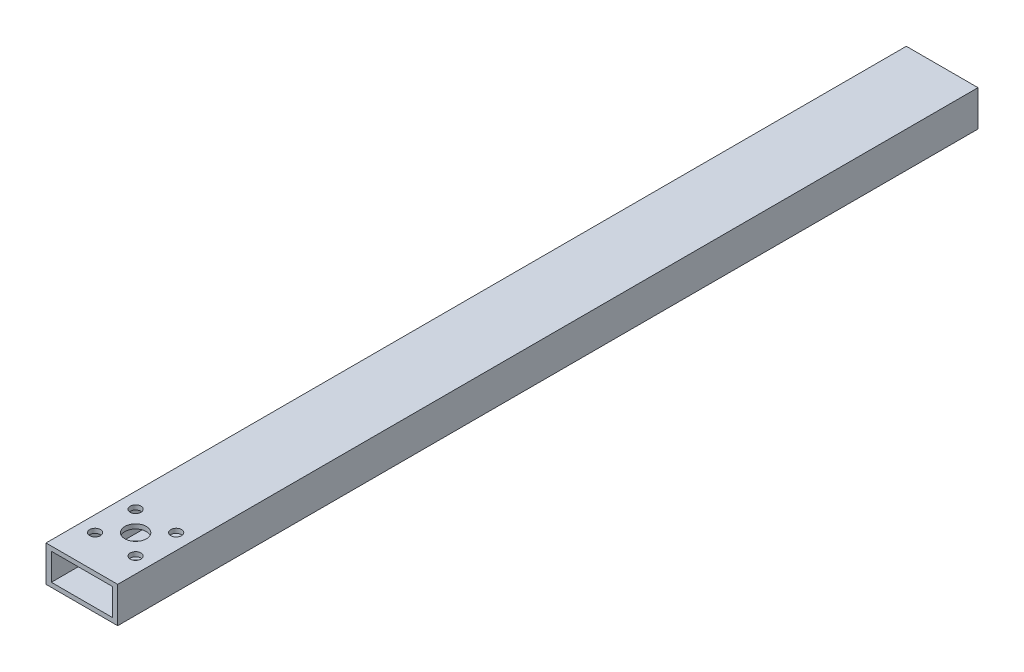
ISO-10303-21;
HEADER;
FILE_DESCRIPTION(('STEP AP214'),'2;1');
FILE_NAME('part.step','',(''),(''),'','','');
FILE_SCHEMA(('AUTOMOTIVE_DESIGN { 1 0 10303 214 1 1 1 1 }'));
ENDSEC;
DATA;
#1=APPLICATION_CONTEXT('core data for automotive mechanical design processes');
#2=APPLICATION_PROTOCOL_DEFINITION('international standard','automotive_design',2000,#1);
#3=PRODUCT_CONTEXT('',#1,'mechanical');
#4=PRODUCT('Part','Part','',(#3));
#5=PRODUCT_RELATED_PRODUCT_CATEGORY('part','',(#4));
#6=PRODUCT_DEFINITION_FORMATION('','',#4);
#7=PRODUCT_DEFINITION_CONTEXT('part definition',#1,'design');
#8=PRODUCT_DEFINITION('design','',#6,#7);
#9=PRODUCT_DEFINITION_SHAPE('','',#8);
#10=(LENGTH_UNIT() NAMED_UNIT(*) SI_UNIT(.MILLI.,.METRE.));
#11=(NAMED_UNIT(*) PLANE_ANGLE_UNIT() SI_UNIT($,.RADIAN.));
#12=(NAMED_UNIT(*) SI_UNIT($,.STERADIAN.) SOLID_ANGLE_UNIT());
#13=UNCERTAINTY_MEASURE_WITH_UNIT(LENGTH_MEASURE(1.E-05),#10,'distance_accuracy_value','');
#14=(GEOMETRIC_REPRESENTATION_CONTEXT(3) GLOBAL_UNCERTAINTY_ASSIGNED_CONTEXT((#13)) GLOBAL_UNIT_ASSIGNED_CONTEXT((#10,
#11,#12)) REPRESENTATION_CONTEXT('',''));
#15=CARTESIAN_POINT('',(0.,0.,0.));
#16=DIRECTION('',(0.,0.,1.));
#17=DIRECTION('',(1.,0.,0.));
#18=AXIS2_PLACEMENT_3D('',#15,#16,#17);
#19=CARTESIAN_POINT('',(0.,0.,200.));
#20=DIRECTION('',(0.,0.,1.));
#21=DIRECTION('',(1.,0.,0.));
#22=AXIS2_PLACEMENT_3D('',#19,#20,#21);
#23=PLANE('',#22);
#24=DIRECTION('',(0.,1.,0.));
#25=VECTOR('',#24,1.);
#26=CARTESIAN_POINT('',(10.,5.,200.));
#27=LINE('',#26,#25);
#28=CARTESIAN_POINT('',(10.,-5.,200.));
#29=VERTEX_POINT('',#28);
#30=CARTESIAN_POINT('',(10.,5.,200.));
#31=VERTEX_POINT('',#30);
#32=EDGE_CURVE('E237',#29,#31,#27,.T.);
#33=ORIENTED_EDGE('',*,*,#32,.T.);
#34=DIRECTION('',(-1.,0.,0.));
#35=VECTOR('',#34,1.);
#36=CARTESIAN_POINT('',(-10.,5.,200.));
#37=LINE('',#36,#35);
#38=CARTESIAN_POINT('',(-10.,5.,200.));
#39=VERTEX_POINT('',#38);
#40=EDGE_CURVE('E240',#31,#39,#37,.T.);
#41=ORIENTED_EDGE('',*,*,#40,.T.);
#42=DIRECTION('',(0.,-1.,0.));
#43=VECTOR('',#42,1.);
#44=CARTESIAN_POINT('',(-10.,5.,200.));
#45=LINE('',#44,#43);
#46=CARTESIAN_POINT('',(-10.,-5.,200.));
#47=VERTEX_POINT('',#46);
#48=EDGE_CURVE('E243',#39,#47,#45,.T.);
#49=ORIENTED_EDGE('',*,*,#48,.T.);
#50=DIRECTION('',(1.,0.,0.));
#51=VECTOR('',#50,1.);
#52=CARTESIAN_POINT('',(-10.,-5.,200.));
#53=LINE('',#52,#51);
#54=EDGE_CURVE('E65',#47,#29,#53,.T.);
#55=ORIENTED_EDGE('',*,*,#54,.T.);
#56=EDGE_LOOP('',(#33,#41,#49,#55));
#57=FACE_BOUND('',#56,.T.);
#58=DIRECTION('',(-1.,0.,0.));
#59=VECTOR('',#58,1.);
#60=CARTESIAN_POINT('',(-8.5,3.75,200.));
#61=LINE('',#60,#59);
#62=CARTESIAN_POINT('',(8.5,3.75,200.));
#63=VERTEX_POINT('',#62);
#64=CARTESIAN_POINT('',(-8.5,3.75,200.));
#65=VERTEX_POINT('',#64);
#66=EDGE_CURVE('E115',#63,#65,#61,.T.);
#67=ORIENTED_EDGE('',*,*,#66,.F.);
#68=DIRECTION('',(0.,1.,0.));
#69=VECTOR('',#68,1.);
#70=CARTESIAN_POINT('',(8.5,3.75,200.));
#71=LINE('',#70,#69);
#72=CARTESIAN_POINT('',(8.5,-3.75,200.));
#73=VERTEX_POINT('',#72);
#74=EDGE_CURVE('E219',#73,#63,#71,.T.);
#75=ORIENTED_EDGE('',*,*,#74,.F.);
#76=DIRECTION('',(1.,0.,0.));
#77=VECTOR('',#76,1.);
#78=CARTESIAN_POINT('',(-8.5,-3.75,200.));
#79=LINE('',#78,#77);
#80=CARTESIAN_POINT('',(-8.5,-3.75,200.));
#81=VERTEX_POINT('',#80);
#82=EDGE_CURVE('E227',#81,#73,#79,.T.);
#83=ORIENTED_EDGE('',*,*,#82,.F.);
#84=DIRECTION('',(0.,-1.,0.));
#85=VECTOR('',#84,1.);
#86=CARTESIAN_POINT('',(-8.5,3.75,200.));
#87=LINE('',#86,#85);
#88=EDGE_CURVE('E224',#65,#81,#87,.T.);
#89=ORIENTED_EDGE('',*,*,#88,.F.);
#90=EDGE_LOOP('',(#67,#75,#83,#89));
#91=FACE_BOUND('',#90,.T.);
#92=ADVANCED_FACE('F39',(#57,#91),#23,.T.);
#93=CARTESIAN_POINT('',(10.,5.,200.));
#94=DIRECTION('',(-1.,0.,0.));
#95=DIRECTION('',(0.,-1.,0.));
#96=AXIS2_PLACEMENT_3D('',#93,#94,#95);
#97=PLANE('',#96);
#98=DIRECTION('',(0.,0.,-1.));
#99=VECTOR('',#98,1.);
#100=CARTESIAN_POINT('',(10.,-5.,200.));
#101=LINE('',#100,#99);
#102=CARTESIAN_POINT('',(10.,-5.,-40.));
#103=VERTEX_POINT('',#102);
#104=EDGE_CURVE('E248',#29,#103,#101,.T.);
#105=ORIENTED_EDGE('',*,*,#104,.T.);
#106=DIRECTION('',(0.,-1.,0.));
#107=VECTOR('',#106,1.);
#108=CARTESIAN_POINT('',(10.,-5.,-40.));
#109=LINE('',#108,#107);
#110=CARTESIAN_POINT('',(10.,5.,-40.));
#111=VERTEX_POINT('',#110);
#112=EDGE_CURVE('E147',#111,#103,#109,.T.);
#113=ORIENTED_EDGE('',*,*,#112,.F.);
#114=DIRECTION('',(0.,0.,-1.));
#115=VECTOR('',#114,1.);
#116=CARTESIAN_POINT('',(10.,5.,200.));
#117=LINE('',#116,#115);
#118=EDGE_CURVE('E11',#31,#111,#117,.T.);
#119=ORIENTED_EDGE('',*,*,#118,.F.);
#120=ORIENTED_EDGE('',*,*,#32,.F.);
#121=EDGE_LOOP('',(#105,#113,#119,#120));
#122=FACE_BOUND('',#121,.T.);
#123=ADVANCED_FACE('F41',(#122),#97,.F.);
#124=CARTESIAN_POINT('',(-10.,5.,200.));
#125=DIRECTION('',(0.,-1.,0.));
#126=DIRECTION('',(0.,0.,-1.));
#127=AXIS2_PLACEMENT_3D('',#124,#125,#126);
#128=PLANE('',#127);
#129=CARTESIAN_POINT('',(-5.65685424949244,5.,190.656854249493));
#130=DIRECTION('',(0.,-1.,0.));
#131=DIRECTION('',(0.,0.,-1.));
#132=AXIS2_PLACEMENT_3D('',#129,#130,#131);
#133=CIRCLE('',#132,1.50000000000002);
#134=CARTESIAN_POINT('',(-5.65685424949244,5.,189.156854249493));
#135=VERTEX_POINT('',#134);
#136=EDGE_CURVE('E173',#135,#135,#133,.T.);
#137=ORIENTED_EDGE('',*,*,#136,.T.);
#138=EDGE_LOOP('',(#137));
#139=FACE_BOUND('',#138,.T.);
#140=CARTESIAN_POINT('',(-5.65685424949251,5.,179.343145750508));
#141=DIRECTION('',(0.,-1.,0.));
#142=DIRECTION('',(0.,0.,-1.));
#143=AXIS2_PLACEMENT_3D('',#140,#141,#142);
#144=CIRCLE('',#143,1.5);
#145=CARTESIAN_POINT('',(-5.65685424949251,5.,177.843145750508));
#146=VERTEX_POINT('',#145);
#147=EDGE_CURVE('E165',#146,#146,#144,.T.);
#148=ORIENTED_EDGE('',*,*,#147,.T.);
#149=EDGE_LOOP('',(#148));
#150=FACE_BOUND('',#149,.T.);
#151=CARTESIAN_POINT('',(5.65685424949253,5.,179.343145750508));
#152=DIRECTION('',(0.,-1.,0.));
#153=DIRECTION('',(0.,0.,-1.));
#154=AXIS2_PLACEMENT_3D('',#151,#152,#153);
#155=CIRCLE('',#154,1.50000000000002);
#156=CARTESIAN_POINT('',(5.65685424949253,5.,177.843145750508));
#157=VERTEX_POINT('',#156);
#158=EDGE_CURVE('E156',#157,#157,#155,.T.);
#159=ORIENTED_EDGE('',*,*,#158,.T.);
#160=EDGE_LOOP('',(#159));
#161=FACE_BOUND('',#160,.T.);
#162=CARTESIAN_POINT('',(5.65685424949259,5.,190.656854249493));
#163=DIRECTION('',(0.,-1.,0.));
#164=DIRECTION('',(0.,0.,-1.));
#165=AXIS2_PLACEMENT_3D('',#162,#163,#164);
#166=CIRCLE('',#165,1.49999999999994);
#167=CARTESIAN_POINT('',(5.65685424949259,5.,189.156854249493));
#168=VERTEX_POINT('',#167);
#169=EDGE_CURVE('E180',#168,#168,#166,.T.);
#170=ORIENTED_EDGE('',*,*,#169,.T.);
#171=EDGE_LOOP('',(#170));
#172=FACE_BOUND('',#171,.T.);
#173=CARTESIAN_POINT('',(0.,5.,185.));
#174=DIRECTION('',(0.,-1.,0.));
#175=DIRECTION('',(0.,0.,-1.));
#176=AXIS2_PLACEMENT_3D('',#173,#174,#175);
#177=CIRCLE('',#176,3.);
#178=CARTESIAN_POINT('',(0.,5.,182.));
#179=VERTEX_POINT('',#178);
#180=EDGE_CURVE('E207',#179,#179,#177,.T.);
#181=ORIENTED_EDGE('',*,*,#180,.T.);
#182=EDGE_LOOP('',(#181));
#183=FACE_BOUND('',#182,.T.);
#184=ORIENTED_EDGE('',*,*,#118,.T.);
#185=DIRECTION('',(1.,0.,0.));
#186=VECTOR('',#185,1.);
#187=CARTESIAN_POINT('',(10.,5.,-40.));
#188=LINE('',#187,#186);
#189=CARTESIAN_POINT('',(-10.,5.,-40.));
#190=VERTEX_POINT('',#189);
#191=EDGE_CURVE('E143',#190,#111,#188,.T.);
#192=ORIENTED_EDGE('',*,*,#191,.F.);
#193=DIRECTION('',(0.,0.,-1.));
#194=VECTOR('',#193,1.);
#195=CARTESIAN_POINT('',(-10.,5.,200.));
#196=LINE('',#195,#194);
#197=EDGE_CURVE('E49',#39,#190,#196,.T.);
#198=ORIENTED_EDGE('',*,*,#197,.F.);
#199=ORIENTED_EDGE('',*,*,#40,.F.);
#200=EDGE_LOOP('',(#184,#192,#198,#199));
#201=FACE_BOUND('',#200,.T.);
#202=ADVANCED_FACE('F293',(#139,#150,#161,#172,#183,#201),#128,.F.);
#203=CARTESIAN_POINT('',(-10.,5.,200.));
#204=DIRECTION('',(1.,0.,0.));
#205=DIRECTION('',(0.,1.,0.));
#206=AXIS2_PLACEMENT_3D('',#203,#204,#205);
#207=PLANE('',#206);
#208=ORIENTED_EDGE('',*,*,#197,.T.);
#209=DIRECTION('',(0.,1.,0.));
#210=VECTOR('',#209,1.);
#211=CARTESIAN_POINT('',(-10.,-5.,-40.));
#212=LINE('',#211,#210);
#213=CARTESIAN_POINT('',(-10.,-5.,-40.));
#214=VERTEX_POINT('',#213);
#215=EDGE_CURVE('E139',#214,#190,#212,.T.);
#216=ORIENTED_EDGE('',*,*,#215,.F.);
#217=DIRECTION('',(0.,0.,-1.));
#218=VECTOR('',#217,1.);
#219=CARTESIAN_POINT('',(-10.,-5.,200.));
#220=LINE('',#219,#218);
#221=EDGE_CURVE('E251',#47,#214,#220,.T.);
#222=ORIENTED_EDGE('',*,*,#221,.F.);
#223=ORIENTED_EDGE('',*,*,#48,.F.);
#224=EDGE_LOOP('',(#208,#216,#222,#223));
#225=FACE_BOUND('',#224,.T.);
#226=ADVANCED_FACE('F301',(#225),#207,.F.);
#227=CARTESIAN_POINT('',(-10.,-5.,200.));
#228=DIRECTION('',(0.,1.,0.));
#229=DIRECTION('',(0.,0.,1.));
#230=AXIS2_PLACEMENT_3D('',#227,#228,#229);
#231=PLANE('',#230);
#232=CARTESIAN_POINT('',(-5.65685424949244,-5.,190.656854249493));
#233=DIRECTION('',(0.,-1.,0.));
#234=DIRECTION('',(0.,0.,-1.));
#235=AXIS2_PLACEMENT_3D('',#232,#233,#234);
#236=CIRCLE('',#235,1.50000000000002);
#237=CARTESIAN_POINT('',(-5.65685424949244,-5.,189.156854249493));
#238=VERTEX_POINT('',#237);
#239=EDGE_CURVE('E155',#238,#238,#236,.T.);
#240=ORIENTED_EDGE('',*,*,#239,.F.);
#241=EDGE_LOOP('',(#240));
#242=FACE_BOUND('',#241,.T.);
#243=CARTESIAN_POINT('',(-5.65685424949251,-5.,179.343145750508));
#244=DIRECTION('',(0.,-1.,0.));
#245=DIRECTION('',(0.,0.,-1.));
#246=AXIS2_PLACEMENT_3D('',#243,#244,#245);
#247=CIRCLE('',#246,1.5);
#248=CARTESIAN_POINT('',(-5.65685424949251,-5.,177.843145750508));
#249=VERTEX_POINT('',#248);
#250=EDGE_CURVE('E169',#249,#249,#247,.T.);
#251=ORIENTED_EDGE('',*,*,#250,.F.);
#252=EDGE_LOOP('',(#251));
#253=FACE_BOUND('',#252,.T.);
#254=CARTESIAN_POINT('',(5.65685424949253,-5.,179.343145750508));
#255=DIRECTION('',(0.,-1.,0.));
#256=DIRECTION('',(0.,0.,-1.));
#257=AXIS2_PLACEMENT_3D('',#254,#255,#256);
#258=CIRCLE('',#257,1.50000000000002);
#259=CARTESIAN_POINT('',(5.65685424949253,-5.,177.843145750508));
#260=VERTEX_POINT('',#259);
#261=EDGE_CURVE('E161',#260,#260,#258,.T.);
#262=ORIENTED_EDGE('',*,*,#261,.F.);
#263=EDGE_LOOP('',(#262));
#264=FACE_BOUND('',#263,.T.);
#265=CARTESIAN_POINT('',(5.65685424949259,-5.,190.656854249493));
#266=DIRECTION('',(0.,-1.,0.));
#267=DIRECTION('',(0.,0.,-1.));
#268=AXIS2_PLACEMENT_3D('',#265,#266,#267);
#269=CIRCLE('',#268,1.49999999999994);
#270=CARTESIAN_POINT('',(5.65685424949259,-5.,189.156854249493));
#271=VERTEX_POINT('',#270);
#272=EDGE_CURVE('E160',#271,#271,#269,.T.);
#273=ORIENTED_EDGE('',*,*,#272,.F.);
#274=EDGE_LOOP('',(#273));
#275=FACE_BOUND('',#274,.T.);
#276=CARTESIAN_POINT('',(0.,-5.,185.));
#277=DIRECTION('',(0.,-1.,0.));
#278=DIRECTION('',(0.,0.,-1.));
#279=AXIS2_PLACEMENT_3D('',#276,#277,#278);
#280=CIRCLE('',#279,3.);
#281=CARTESIAN_POINT('',(0.,-5.,182.));
#282=VERTEX_POINT('',#281);
#283=EDGE_CURVE('E206',#282,#282,#280,.T.);
#284=ORIENTED_EDGE('',*,*,#283,.F.);
#285=EDGE_LOOP('',(#284));
#286=FACE_BOUND('',#285,.T.);
#287=ORIENTED_EDGE('',*,*,#221,.T.);
#288=DIRECTION('',(-1.,0.,0.));
#289=VECTOR('',#288,1.);
#290=CARTESIAN_POINT('',(10.,-5.,-40.));
#291=LINE('',#290,#289);
#292=EDGE_CURVE('E151',#103,#214,#291,.T.);
#293=ORIENTED_EDGE('',*,*,#292,.F.);
#294=ORIENTED_EDGE('',*,*,#104,.F.);
#295=ORIENTED_EDGE('',*,*,#54,.F.);
#296=EDGE_LOOP('',(#287,#293,#294,#295));
#297=FACE_BOUND('',#296,.T.);
#298=ADVANCED_FACE('F298',(#242,#253,#264,#275,#286,#297),#231,.F.);
#299=CARTESIAN_POINT('',(8.5,3.75,200.));
#300=DIRECTION('',(-1.,0.,0.));
#301=DIRECTION('',(0.,-1.,0.));
#302=AXIS2_PLACEMENT_3D('',#299,#300,#301);
#303=PLANE('',#302);
#304=DIRECTION('',(0.,0.,-1.));
#305=VECTOR('',#304,1.);
#306=CARTESIAN_POINT('',(8.5,3.75,200.));
#307=LINE('',#306,#305);
#308=CARTESIAN_POINT('',(8.5,3.75,-40.));
#309=VERTEX_POINT('',#308);
#310=EDGE_CURVE('E119',#63,#309,#307,.T.);
#311=ORIENTED_EDGE('',*,*,#310,.T.);
#312=DIRECTION('',(0.,-1.,0.));
#313=VECTOR('',#312,1.);
#314=CARTESIAN_POINT('',(8.5,-3.75,-40.));
#315=LINE('',#314,#313);
#316=CARTESIAN_POINT('',(8.5,-3.75,-40.));
#317=VERTEX_POINT('',#316);
#318=EDGE_CURVE('E130',#309,#317,#315,.T.);
#319=ORIENTED_EDGE('',*,*,#318,.T.);
#320=DIRECTION('',(0.,0.,-1.));
#321=VECTOR('',#320,1.);
#322=CARTESIAN_POINT('',(8.5,-3.75,200.));
#323=LINE('',#322,#321);
#324=EDGE_CURVE('E230',#73,#317,#323,.T.);
#325=ORIENTED_EDGE('',*,*,#324,.F.);
#326=ORIENTED_EDGE('',*,*,#74,.T.);
#327=EDGE_LOOP('',(#311,#319,#325,#326));
#328=FACE_BOUND('',#327,.T.);
#329=ADVANCED_FACE('F286',(#328),#303,.T.);
#330=CARTESIAN_POINT('',(-8.5,3.75,200.));
#331=DIRECTION('',(0.,-1.,0.));
#332=DIRECTION('',(0.,0.,-1.));
#333=AXIS2_PLACEMENT_3D('',#330,#331,#332);
#334=PLANE('',#333);
#335=CARTESIAN_POINT('',(-5.65685424949244,3.75,190.656854249493));
#336=DIRECTION('',(0.,-1.,0.));
#337=DIRECTION('',(0.,0.,-1.));
#338=AXIS2_PLACEMENT_3D('',#335,#336,#337);
#339=CIRCLE('',#338,1.50000000000002);
#340=CARTESIAN_POINT('',(-5.65685424949244,3.75,189.156854249493));
#341=VERTEX_POINT('',#340);
#342=EDGE_CURVE('E202',#341,#341,#339,.T.);
#343=ORIENTED_EDGE('',*,*,#342,.F.);
#344=EDGE_LOOP('',(#343));
#345=FACE_BOUND('',#344,.T.);
#346=CARTESIAN_POINT('',(-5.65685424949251,3.75,179.343145750508));
#347=DIRECTION('',(0.,-1.,0.));
#348=DIRECTION('',(0.,0.,-1.));
#349=AXIS2_PLACEMENT_3D('',#346,#347,#348);
#350=CIRCLE('',#349,1.5);
#351=CARTESIAN_POINT('',(-5.65685424949251,3.75,177.843145750508));
#352=VERTEX_POINT('',#351);
#353=EDGE_CURVE('E198',#352,#352,#350,.T.);
#354=ORIENTED_EDGE('',*,*,#353,.F.);
#355=EDGE_LOOP('',(#354));
#356=FACE_BOUND('',#355,.T.);
#357=CARTESIAN_POINT('',(5.65685424949253,3.75,179.343145750508));
#358=DIRECTION('',(0.,-1.,0.));
#359=DIRECTION('',(0.,0.,-1.));
#360=AXIS2_PLACEMENT_3D('',#357,#358,#359);
#361=CIRCLE('',#360,1.50000000000002);
#362=CARTESIAN_POINT('',(5.65685424949253,3.75,177.843145750508));
#363=VERTEX_POINT('',#362);
#364=EDGE_CURVE('E193',#363,#363,#361,.T.);
#365=ORIENTED_EDGE('',*,*,#364,.F.);
#366=EDGE_LOOP('',(#365));
#367=FACE_BOUND('',#366,.T.);
#368=CARTESIAN_POINT('',(5.65685424949259,3.75,190.656854249493));
#369=DIRECTION('',(0.,-1.,0.));
#370=DIRECTION('',(0.,0.,-1.));
#371=AXIS2_PLACEMENT_3D('',#368,#369,#370);
#372=CIRCLE('',#371,1.49999999999994);
#373=CARTESIAN_POINT('',(5.65685424949259,3.75,189.156854249493));
#374=VERTEX_POINT('',#373);
#375=EDGE_CURVE('E188',#374,#374,#372,.T.);
#376=ORIENTED_EDGE('',*,*,#375,.F.);
#377=EDGE_LOOP('',(#376));
#378=FACE_BOUND('',#377,.T.);
#379=CARTESIAN_POINT('',(0.,3.75,185.));
#380=DIRECTION('',(0.,-1.,0.));
#381=DIRECTION('',(0.,0.,-1.));
#382=AXIS2_PLACEMENT_3D('',#379,#380,#381);
#383=CIRCLE('',#382,3.);
#384=CARTESIAN_POINT('',(0.,3.75,182.));
#385=VERTEX_POINT('',#384);
#386=EDGE_CURVE('E215',#385,#385,#383,.T.);
#387=ORIENTED_EDGE('',*,*,#386,.F.);
#388=EDGE_LOOP('',(#387));
#389=FACE_BOUND('',#388,.T.);
#390=DIRECTION('',(0.,0.,-1.));
#391=VECTOR('',#390,1.);
#392=CARTESIAN_POINT('',(-8.5,3.75,200.));
#393=LINE('',#392,#391);
#394=CARTESIAN_POINT('',(-8.5,3.75,-40.));
#395=VERTEX_POINT('',#394);
#396=EDGE_CURVE('E107',#65,#395,#393,.T.);
#397=ORIENTED_EDGE('',*,*,#396,.T.);
#398=DIRECTION('',(1.,0.,0.));
#399=VECTOR('',#398,1.);
#400=CARTESIAN_POINT('',(8.5,3.75,-40.));
#401=LINE('',#400,#399);
#402=EDGE_CURVE('E112',#395,#309,#401,.T.);
#403=ORIENTED_EDGE('',*,*,#402,.T.);
#404=ORIENTED_EDGE('',*,*,#310,.F.);
#405=ORIENTED_EDGE('',*,*,#66,.T.);
#406=EDGE_LOOP('',(#397,#403,#404,#405));
#407=FACE_BOUND('',#406,.T.);
#408=ADVANCED_FACE('F109',(#345,#356,#367,#378,#389,#407),#334,.T.);
#409=CARTESIAN_POINT('',(-8.5,3.75,200.));
#410=DIRECTION('',(1.,0.,0.));
#411=DIRECTION('',(0.,1.,0.));
#412=AXIS2_PLACEMENT_3D('',#409,#410,#411);
#413=PLANE('',#412);
#414=DIRECTION('',(0.,0.,-1.));
#415=VECTOR('',#414,1.);
#416=CARTESIAN_POINT('',(-8.5,-3.75,200.));
#417=LINE('',#416,#415);
#418=CARTESIAN_POINT('',(-8.5,-3.75,-40.));
#419=VERTEX_POINT('',#418);
#420=EDGE_CURVE('E57',#81,#419,#417,.T.);
#421=ORIENTED_EDGE('',*,*,#420,.T.);
#422=DIRECTION('',(0.,1.,0.));
#423=VECTOR('',#422,1.);
#424=CARTESIAN_POINT('',(-8.5,-3.75,-40.));
#425=LINE('',#424,#423);
#426=EDGE_CURVE('E122',#419,#395,#425,.T.);
#427=ORIENTED_EDGE('',*,*,#426,.T.);
#428=ORIENTED_EDGE('',*,*,#396,.F.);
#429=ORIENTED_EDGE('',*,*,#88,.T.);
#430=EDGE_LOOP('',(#421,#427,#428,#429));
#431=FACE_BOUND('',#430,.T.);
#432=ADVANCED_FACE('F123',(#431),#413,.T.);
#433=CARTESIAN_POINT('',(-8.5,-3.75,200.));
#434=DIRECTION('',(0.,1.,0.));
#435=DIRECTION('',(0.,0.,1.));
#436=AXIS2_PLACEMENT_3D('',#433,#434,#435);
#437=PLANE('',#436);
#438=CARTESIAN_POINT('',(-5.65685424949244,-3.75,190.656854249493));
#439=DIRECTION('',(0.,1.,0.));
#440=DIRECTION('',(0.,0.,1.));
#441=AXIS2_PLACEMENT_3D('',#438,#439,#440);
#442=CIRCLE('',#441,1.50000000000002);
#443=CARTESIAN_POINT('',(-5.65685424949244,-3.75,192.156854249493));
#444=VERTEX_POINT('',#443);
#445=EDGE_CURVE('E43',#444,#444,#442,.T.);
#446=ORIENTED_EDGE('',*,*,#445,.F.);
#447=EDGE_LOOP('',(#446));
#448=FACE_BOUND('',#447,.T.);
#449=CARTESIAN_POINT('',(-5.65685424949251,-3.75,179.343145750508));
#450=DIRECTION('',(0.,1.,0.));
#451=DIRECTION('',(0.,0.,1.));
#452=AXIS2_PLACEMENT_3D('',#449,#450,#451);
#453=CIRCLE('',#452,1.5);
#454=CARTESIAN_POINT('',(-5.65685424949251,-3.75,180.843145750508));
#455=VERTEX_POINT('',#454);
#456=EDGE_CURVE('E197',#455,#455,#453,.T.);
#457=ORIENTED_EDGE('',*,*,#456,.F.);
#458=EDGE_LOOP('',(#457));
#459=FACE_BOUND('',#458,.T.);
#460=CARTESIAN_POINT('',(5.65685424949253,-3.75,179.343145750508));
#461=DIRECTION('',(0.,1.,0.));
#462=DIRECTION('',(0.,0.,1.));
#463=AXIS2_PLACEMENT_3D('',#460,#461,#462);
#464=CIRCLE('',#463,1.50000000000002);
#465=CARTESIAN_POINT('',(5.65685424949253,-3.75,180.843145750508));
#466=VERTEX_POINT('',#465);
#467=EDGE_CURVE('E192',#466,#466,#464,.T.);
#468=ORIENTED_EDGE('',*,*,#467,.F.);
#469=EDGE_LOOP('',(#468));
#470=FACE_BOUND('',#469,.T.);
#471=CARTESIAN_POINT('',(5.65685424949259,-3.75,190.656854249493));
#472=DIRECTION('',(0.,1.,0.));
#473=DIRECTION('',(0.,0.,1.));
#474=AXIS2_PLACEMENT_3D('',#471,#472,#473);
#475=CIRCLE('',#474,1.49999999999994);
#476=CARTESIAN_POINT('',(5.65685424949259,-3.75,192.156854249493));
#477=VERTEX_POINT('',#476);
#478=EDGE_CURVE('E184',#477,#477,#475,.T.);
#479=ORIENTED_EDGE('',*,*,#478,.F.);
#480=EDGE_LOOP('',(#479));
#481=FACE_BOUND('',#480,.T.);
#482=CARTESIAN_POINT('',(0.,-3.75,185.));
#483=DIRECTION('',(0.,1.,0.));
#484=DIRECTION('',(0.,0.,1.));
#485=AXIS2_PLACEMENT_3D('',#482,#483,#484);
#486=CIRCLE('',#485,3.);
#487=CARTESIAN_POINT('',(0.,-3.75,188.));
#488=VERTEX_POINT('',#487);
#489=EDGE_CURVE('E211',#488,#488,#486,.T.);
#490=ORIENTED_EDGE('',*,*,#489,.F.);
#491=EDGE_LOOP('',(#490));
#492=FACE_BOUND('',#491,.T.);
#493=ORIENTED_EDGE('',*,*,#324,.T.);
#494=DIRECTION('',(-1.,0.,0.));
#495=VECTOR('',#494,1.);
#496=CARTESIAN_POINT('',(8.5,-3.75,-40.));
#497=LINE('',#496,#495);
#498=EDGE_CURVE('E134',#317,#419,#497,.T.);
#499=ORIENTED_EDGE('',*,*,#498,.T.);
#500=ORIENTED_EDGE('',*,*,#420,.F.);
#501=ORIENTED_EDGE('',*,*,#82,.T.);
#502=EDGE_LOOP('',(#493,#499,#500,#501));
#503=FACE_BOUND('',#502,.T.);
#504=ADVANCED_FACE('F271',(#448,#459,#470,#481,#492,#503),#437,.T.);
#505=CARTESIAN_POINT('',(0.,5.,185.));
#506=DIRECTION('',(0.,-1.,0.));
#507=DIRECTION('',(0.,0.,-1.));
#508=AXIS2_PLACEMENT_3D('',#505,#506,#507);
#509=CYLINDRICAL_SURFACE('',#508,3.);
#510=ORIENTED_EDGE('',*,*,#489,.T.);
#511=EDGE_LOOP('',(#510));
#512=FACE_BOUND('',#511,.T.);
#513=ORIENTED_EDGE('',*,*,#283,.T.);
#514=EDGE_LOOP('',(#513));
#515=FACE_BOUND('',#514,.T.);
#516=ADVANCED_FACE('F274',(#512,#515),#509,.F.);
#517=ORIENTED_EDGE('',*,*,#386,.T.);
#518=EDGE_LOOP('',(#517));
#519=FACE_BOUND('',#518,.T.);
#520=ORIENTED_EDGE('',*,*,#180,.F.);
#521=EDGE_LOOP('',(#520));
#522=FACE_BOUND('',#521,.T.);
#523=ADVANCED_FACE('F354',(#519,#522),#509,.F.);
#524=CARTESIAN_POINT('',(5.65685424949259,5.,190.656854249493));
#525=DIRECTION('',(0.,-1.,0.));
#526=DIRECTION('',(0.,0.,-1.));
#527=AXIS2_PLACEMENT_3D('',#524,#525,#526);
#528=CYLINDRICAL_SURFACE('',#527,1.49999999999994);
#529=ORIENTED_EDGE('',*,*,#478,.T.);
#530=EDGE_LOOP('',(#529));
#531=FACE_BOUND('',#530,.T.);
#532=ORIENTED_EDGE('',*,*,#272,.T.);
#533=EDGE_LOOP('',(#532));
#534=FACE_BOUND('',#533,.T.);
#535=ADVANCED_FACE('F344',(#531,#534),#528,.F.);
#536=CARTESIAN_POINT('',(5.65685424949253,5.,179.343145750508));
#537=DIRECTION('',(0.,-1.,0.));
#538=DIRECTION('',(0.,0.,-1.));
#539=AXIS2_PLACEMENT_3D('',#536,#537,#538);
#540=CYLINDRICAL_SURFACE('',#539,1.50000000000002);
#541=ORIENTED_EDGE('',*,*,#467,.T.);
#542=EDGE_LOOP('',(#541));
#543=FACE_BOUND('',#542,.T.);
#544=ORIENTED_EDGE('',*,*,#261,.T.);
#545=EDGE_LOOP('',(#544));
#546=FACE_BOUND('',#545,.T.);
#547=ADVANCED_FACE('F341',(#543,#546),#540,.F.);
#548=CARTESIAN_POINT('',(-5.65685424949251,5.,179.343145750508));
#549=DIRECTION('',(0.,-1.,0.));
#550=DIRECTION('',(0.,0.,-1.));
#551=AXIS2_PLACEMENT_3D('',#548,#549,#550);
#552=CYLINDRICAL_SURFACE('',#551,1.5);
#553=ORIENTED_EDGE('',*,*,#456,.T.);
#554=EDGE_LOOP('',(#553));
#555=FACE_BOUND('',#554,.T.);
#556=ORIENTED_EDGE('',*,*,#250,.T.);
#557=EDGE_LOOP('',(#556));
#558=FACE_BOUND('',#557,.T.);
#559=ADVANCED_FACE('F268',(#555,#558),#552,.F.);
#560=CARTESIAN_POINT('',(-5.65685424949244,5.,190.656854249493));
#561=DIRECTION('',(0.,-1.,0.));
#562=DIRECTION('',(0.,0.,-1.));
#563=AXIS2_PLACEMENT_3D('',#560,#561,#562);
#564=CYLINDRICAL_SURFACE('',#563,1.50000000000002);
#565=ORIENTED_EDGE('',*,*,#445,.T.);
#566=EDGE_LOOP('',(#565));
#567=FACE_BOUND('',#566,.T.);
#568=ORIENTED_EDGE('',*,*,#239,.T.);
#569=EDGE_LOOP('',(#568));
#570=FACE_BOUND('',#569,.T.);
#571=ADVANCED_FACE('F339',(#567,#570),#564,.F.);
#572=ORIENTED_EDGE('',*,*,#375,.T.);
#573=EDGE_LOOP('',(#572));
#574=FACE_BOUND('',#573,.T.);
#575=ORIENTED_EDGE('',*,*,#169,.F.);
#576=EDGE_LOOP('',(#575));
#577=FACE_BOUND('',#576,.T.);
#578=ADVANCED_FACE('F350',(#574,#577),#528,.F.);
#579=ORIENTED_EDGE('',*,*,#364,.T.);
#580=EDGE_LOOP('',(#579));
#581=FACE_BOUND('',#580,.T.);
#582=ORIENTED_EDGE('',*,*,#158,.F.);
#583=EDGE_LOOP('',(#582));
#584=FACE_BOUND('',#583,.T.);
#585=ADVANCED_FACE('F346',(#581,#584),#540,.F.);
#586=ORIENTED_EDGE('',*,*,#353,.T.);
#587=EDGE_LOOP('',(#586));
#588=FACE_BOUND('',#587,.T.);
#589=ORIENTED_EDGE('',*,*,#147,.F.);
#590=EDGE_LOOP('',(#589));
#591=FACE_BOUND('',#590,.T.);
#592=ADVANCED_FACE('F336',(#588,#591),#552,.F.);
#593=ORIENTED_EDGE('',*,*,#342,.T.);
#594=EDGE_LOOP('',(#593));
#595=FACE_BOUND('',#594,.T.);
#596=ORIENTED_EDGE('',*,*,#136,.F.);
#597=EDGE_LOOP('',(#596));
#598=FACE_BOUND('',#597,.T.);
#599=ADVANCED_FACE('F331',(#595,#598),#564,.F.);
#600=CARTESIAN_POINT('',(0.,0.,-40.));
#601=DIRECTION('',(0.,0.,1.));
#602=DIRECTION('',(1.,0.,0.));
#603=AXIS2_PLACEMENT_3D('',#600,#601,#602);
#604=PLANE('',#603);
#605=ORIENTED_EDGE('',*,*,#215,.T.);
#606=ORIENTED_EDGE('',*,*,#191,.T.);
#607=ORIENTED_EDGE('',*,*,#112,.T.);
#608=ORIENTED_EDGE('',*,*,#292,.T.);
#609=EDGE_LOOP('',(#605,#606,#607,#608));
#610=FACE_BOUND('',#609,.T.);
#611=ORIENTED_EDGE('',*,*,#426,.F.);
#612=ORIENTED_EDGE('',*,*,#498,.F.);
#613=ORIENTED_EDGE('',*,*,#318,.F.);
#614=ORIENTED_EDGE('',*,*,#402,.F.);
#615=EDGE_LOOP('',(#611,#612,#613,#614));
#616=FACE_BOUND('',#615,.T.);
#617=ADVANCED_FACE('F128',(#610,#616),#604,.F.);
#618=CLOSED_SHELL('',(#92,#123,#202,#226,#298,#329,#408,#432,#504,#516,#523,#535,#547,#559,#571,
#578,#585,#592,#599,#617));
#619=MANIFOLD_SOLID_BREP('B2',#618);
#620=ADVANCED_BREP_SHAPE_REPRESENTATION('',(#18,#619),#14);
#621=SHAPE_DEFINITION_REPRESENTATION(#9,#620);
ENDSEC;
END-ISO-10303-21;
